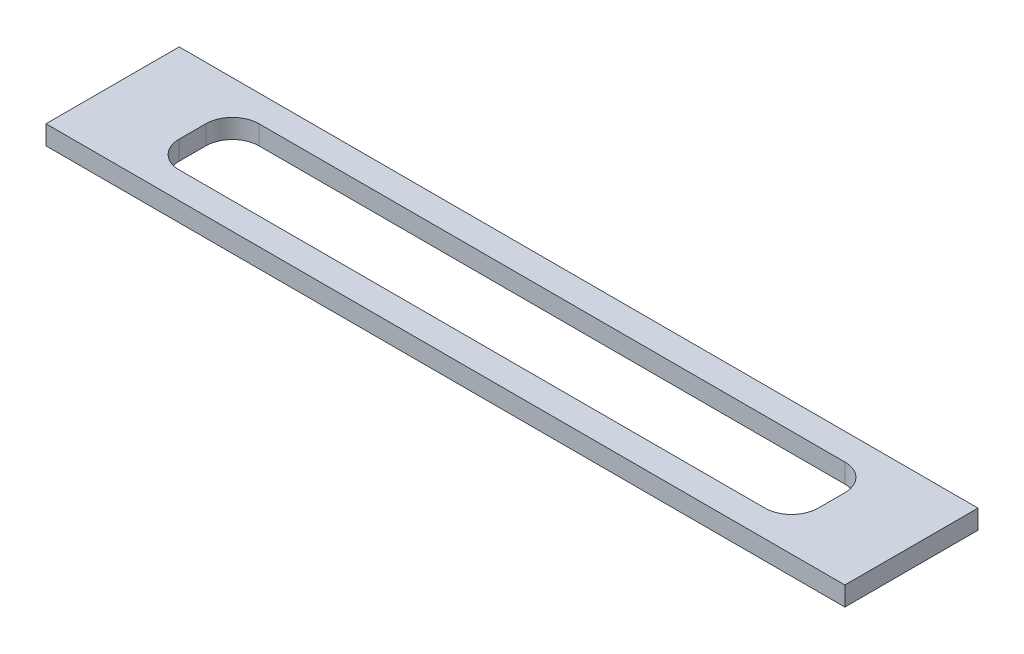
ISO-10303-21;
HEADER;
FILE_DESCRIPTION(('STEP AP214'),'2;1');
FILE_NAME('part.step','',(''),(''),'','','');
FILE_SCHEMA(('AUTOMOTIVE_DESIGN { 1 0 10303 214 1 1 1 1 }'));
ENDSEC;
DATA;
#1=APPLICATION_CONTEXT('core data for automotive mechanical design processes');
#2=APPLICATION_PROTOCOL_DEFINITION('international standard','automotive_design',2000,#1);
#3=PRODUCT_CONTEXT('',#1,'mechanical');
#4=PRODUCT('Part','Part','',(#3));
#5=PRODUCT_RELATED_PRODUCT_CATEGORY('part','',(#4));
#6=PRODUCT_DEFINITION_FORMATION('','',#4);
#7=PRODUCT_DEFINITION_CONTEXT('part definition',#1,'design');
#8=PRODUCT_DEFINITION('design','',#6,#7);
#9=PRODUCT_DEFINITION_SHAPE('','',#8);
#10=(LENGTH_UNIT() NAMED_UNIT(*) SI_UNIT(.MILLI.,.METRE.));
#11=(NAMED_UNIT(*) PLANE_ANGLE_UNIT() SI_UNIT($,.RADIAN.));
#12=(NAMED_UNIT(*) SI_UNIT($,.STERADIAN.) SOLID_ANGLE_UNIT());
#13=UNCERTAINTY_MEASURE_WITH_UNIT(LENGTH_MEASURE(1.E-05),#10,'distance_accuracy_value','');
#14=(GEOMETRIC_REPRESENTATION_CONTEXT(3) GLOBAL_UNCERTAINTY_ASSIGNED_CONTEXT((#13)) GLOBAL_UNIT_ASSIGNED_CONTEXT((#10,
#11,#12)) REPRESENTATION_CONTEXT('',''));
#15=CARTESIAN_POINT('',(0.,0.,0.));
#16=DIRECTION('',(0.,0.,1.));
#17=DIRECTION('',(1.,0.,0.));
#18=AXIS2_PLACEMENT_3D('',#15,#16,#17);
#19=CARTESIAN_POINT('',(-691.829571311172,18.288,43.3638310405165));
#20=DIRECTION('',(1.,0.,0.));
#21=DIRECTION('',(0.,0.,-1.));
#22=AXIS2_PLACEMENT_3D('',#19,#20,#21);
#23=PLANE('',#22);
#24=DIRECTION('',(0.,0.,1.));
#25=VECTOR('',#24,1.);
#26=CARTESIAN_POINT('',(-691.829571311172,0.,43.3638310405165));
#27=LINE('',#26,#25);
#28=CARTESIAN_POINT('',(-691.829571311172,0.,43.3638310405165));
#29=VERTEX_POINT('',#28);
#30=CARTESIAN_POINT('',(-691.829571311172,0.,170.363831040516));
#31=VERTEX_POINT('',#30);
#32=EDGE_CURVE('E150',#29,#31,#27,.T.);
#33=ORIENTED_EDGE('',*,*,#32,.T.);
#34=DIRECTION('',(0.,-1.,0.));
#35=VECTOR('',#34,1.);
#36=CARTESIAN_POINT('',(-691.829571311172,18.288,170.363831040516));
#37=LINE('',#36,#35);
#38=CARTESIAN_POINT('',(-691.829571311172,18.288,170.363831040516));
#39=VERTEX_POINT('',#38);
#40=EDGE_CURVE('E131',#39,#31,#37,.T.);
#41=ORIENTED_EDGE('',*,*,#40,.F.);
#42=DIRECTION('',(0.,0.,1.));
#43=VECTOR('',#42,1.);
#44=CARTESIAN_POINT('',(-691.829571311172,18.288,43.3638310405165));
#45=LINE('',#44,#43);
#46=CARTESIAN_POINT('',(-691.829571311172,18.288,43.3638310405165));
#47=VERTEX_POINT('',#46);
#48=EDGE_CURVE('E138',#47,#39,#45,.T.);
#49=ORIENTED_EDGE('',*,*,#48,.F.);
#50=DIRECTION('',(0.,-1.,0.));
#51=VECTOR('',#50,1.);
#52=CARTESIAN_POINT('',(-691.829571311172,18.288,43.3638310405165));
#53=LINE('',#52,#51);
#54=EDGE_CURVE('E222',#47,#29,#53,.T.);
#55=ORIENTED_EDGE('',*,*,#54,.T.);
#56=EDGE_LOOP('',(#33,#41,#49,#55));
#57=FACE_BOUND('',#56,.T.);
#58=ADVANCED_FACE('F38',(#57),#23,.F.);
#59=CARTESIAN_POINT('',(-691.829571311172,18.288,170.363831040516));
#60=DIRECTION('',(0.,0.,-1.));
#61=DIRECTION('',(-1.,0.,0.));
#62=AXIS2_PLACEMENT_3D('',#59,#60,#61);
#63=PLANE('',#62);
#64=DIRECTION('',(1.,0.,0.));
#65=VECTOR('',#64,1.);
#66=CARTESIAN_POINT('',(-691.829571311172,0.,170.363831040516));
#67=LINE('',#66,#65);
#68=CARTESIAN_POINT('',(70.1704286888285,0.,170.363831040516));
#69=VERTEX_POINT('',#68);
#70=EDGE_CURVE('E224',#31,#69,#67,.T.);
#71=ORIENTED_EDGE('',*,*,#70,.T.);
#72=DIRECTION('',(0.,-1.,0.));
#73=VECTOR('',#72,1.);
#74=CARTESIAN_POINT('',(70.1704286888285,18.288,170.363831040516));
#75=LINE('',#74,#73);
#76=CARTESIAN_POINT('',(70.1704286888285,18.288,170.363831040516));
#77=VERTEX_POINT('',#76);
#78=EDGE_CURVE('E134',#77,#69,#75,.T.);
#79=ORIENTED_EDGE('',*,*,#78,.F.);
#80=DIRECTION('',(1.,0.,0.));
#81=VECTOR('',#80,1.);
#82=CARTESIAN_POINT('',(-691.829571311172,18.288,170.363831040516));
#83=LINE('',#82,#81);
#84=EDGE_CURVE('E127',#39,#77,#83,.T.);
#85=ORIENTED_EDGE('',*,*,#84,.F.);
#86=ORIENTED_EDGE('',*,*,#40,.T.);
#87=EDGE_LOOP('',(#71,#79,#85,#86));
#88=FACE_BOUND('',#87,.T.);
#89=ADVANCED_FACE('F129',(#88),#63,.F.);
#90=CARTESIAN_POINT('',(70.1704286888286,18.288,43.3638310405165));
#91=DIRECTION('',(-1.,0.,0.));
#92=DIRECTION('',(0.,0.,1.));
#93=AXIS2_PLACEMENT_3D('',#90,#91,#92);
#94=PLANE('',#93);
#95=DIRECTION('',(0.,0.,-1.));
#96=VECTOR('',#95,1.);
#97=CARTESIAN_POINT('',(70.1704286888286,0.,43.3638310405165));
#98=LINE('',#97,#96);
#99=CARTESIAN_POINT('',(70.1704286888286,0.,43.3638310405165));
#100=VERTEX_POINT('',#99);
#101=EDGE_CURVE('E226',#69,#100,#98,.T.);
#102=ORIENTED_EDGE('',*,*,#101,.T.);
#103=DIRECTION('',(0.,-1.,0.));
#104=VECTOR('',#103,1.);
#105=CARTESIAN_POINT('',(70.1704286888286,18.288,43.3638310405165));
#106=LINE('',#105,#104);
#107=CARTESIAN_POINT('',(70.1704286888286,18.288,43.3638310405165));
#108=VERTEX_POINT('',#107);
#109=EDGE_CURVE('E155',#108,#100,#106,.T.);
#110=ORIENTED_EDGE('',*,*,#109,.F.);
#111=DIRECTION('',(0.,0.,-1.));
#112=VECTOR('',#111,1.);
#113=CARTESIAN_POINT('',(70.1704286888286,18.288,43.3638310405165));
#114=LINE('',#113,#112);
#115=EDGE_CURVE('E137',#77,#108,#114,.T.);
#116=ORIENTED_EDGE('',*,*,#115,.F.);
#117=ORIENTED_EDGE('',*,*,#78,.T.);
#118=EDGE_LOOP('',(#102,#110,#116,#117));
#119=FACE_BOUND('',#118,.T.);
#120=ADVANCED_FACE('F238',(#119),#94,.F.);
#121=CARTESIAN_POINT('',(-691.829571311172,18.288,43.3638310405165));
#122=DIRECTION('',(0.,0.,1.));
#123=DIRECTION('',(1.,0.,0.));
#124=AXIS2_PLACEMENT_3D('',#121,#122,#123);
#125=PLANE('',#124);
#126=DIRECTION('',(-1.,0.,0.));
#127=VECTOR('',#126,1.);
#128=CARTESIAN_POINT('',(-691.829571311172,0.,43.3638310405165));
#129=LINE('',#128,#127);
#130=EDGE_CURVE('E147',#100,#29,#129,.T.);
#131=ORIENTED_EDGE('',*,*,#130,.T.);
#132=ORIENTED_EDGE('',*,*,#54,.F.);
#133=DIRECTION('',(-1.,0.,0.));
#134=VECTOR('',#133,1.);
#135=CARTESIAN_POINT('',(-691.829571311172,18.288,43.3638310405165));
#136=LINE('',#135,#134);
#137=EDGE_CURVE('E143',#108,#47,#136,.T.);
#138=ORIENTED_EDGE('',*,*,#137,.F.);
#139=ORIENTED_EDGE('',*,*,#109,.T.);
#140=EDGE_LOOP('',(#131,#132,#138,#139));
#141=FACE_BOUND('',#140,.T.);
#142=ADVANCED_FACE('F233',(#141),#125,.F.);
#143=CARTESIAN_POINT('',(0.,18.288,0.));
#144=DIRECTION('',(0.,1.,0.));
#145=DIRECTION('',(0.,0.,1.));
#146=AXIS2_PLACEMENT_3D('',#143,#144,#145);
#147=PLANE('',#146);
#148=DIRECTION('',(0.,0.,-1.));
#149=VECTOR('',#148,1.);
#150=CARTESIAN_POINT('',(-6.0295713111715,18.288,144.963831040516));
#151=LINE('',#150,#149);
#152=CARTESIAN_POINT('',(-6.0295713111715,18.288,119.563831040516));
#153=VERTEX_POINT('',#152);
#154=CARTESIAN_POINT('',(-6.0295713111715,18.288,94.1638310405165));
#155=VERTEX_POINT('',#154);
#156=EDGE_CURVE('E200',#153,#155,#151,.T.);
#157=ORIENTED_EDGE('',*,*,#156,.F.);
#158=CARTESIAN_POINT('',(-31.4295713111715,18.288,119.563831040516));
#159=DIRECTION('',(0.,1.,0.));
#160=DIRECTION('',(0.,0.,1.));
#161=AXIS2_PLACEMENT_3D('',#158,#159,#160);
#162=CIRCLE('',#161,25.4);
#163=CARTESIAN_POINT('',(-31.4295713111717,18.288,144.963831040516));
#164=VERTEX_POINT('',#163);
#165=EDGE_CURVE('E179',#153,#164,#162,.F.);
#166=ORIENTED_EDGE('',*,*,#165,.T.);
#167=DIRECTION('',(1.,0.,0.));
#168=VECTOR('',#167,1.);
#169=CARTESIAN_POINT('',(-615.629571311172,18.288,144.963831040516));
#170=LINE('',#169,#168);
#171=CARTESIAN_POINT('',(-590.229571311172,18.288,144.963831040516));
#172=VERTEX_POINT('',#171);
#173=EDGE_CURVE('E217',#172,#164,#170,.T.);
#174=ORIENTED_EDGE('',*,*,#173,.F.);
#175=CARTESIAN_POINT('',(-590.229571311172,18.288,119.563831040516));
#176=DIRECTION('',(0.,1.,0.));
#177=DIRECTION('',(0.,0.,1.));
#178=AXIS2_PLACEMENT_3D('',#175,#176,#177);
#179=CIRCLE('',#178,25.4);
#180=CARTESIAN_POINT('',(-615.629571311172,18.288,119.563831040516));
#181=VERTEX_POINT('',#180);
#182=EDGE_CURVE('E183',#172,#181,#179,.F.);
#183=ORIENTED_EDGE('',*,*,#182,.T.);
#184=DIRECTION('',(0.,0.,1.));
#185=VECTOR('',#184,1.);
#186=CARTESIAN_POINT('',(-615.629571311172,18.288,144.963831040516));
#187=LINE('',#186,#185);
#188=CARTESIAN_POINT('',(-615.629571311172,18.288,94.1638310405165));
#189=VERTEX_POINT('',#188);
#190=EDGE_CURVE('E192',#189,#181,#187,.T.);
#191=ORIENTED_EDGE('',*,*,#190,.F.);
#192=CARTESIAN_POINT('',(-590.229571311172,18.288,94.1638310405165));
#193=DIRECTION('',(0.,1.,0.));
#194=DIRECTION('',(0.,0.,1.));
#195=AXIS2_PLACEMENT_3D('',#192,#193,#194);
#196=CIRCLE('',#195,25.4);
#197=CARTESIAN_POINT('',(-590.229571311172,18.288,68.7638310405165));
#198=VERTEX_POINT('',#197);
#199=EDGE_CURVE('E46',#189,#198,#196,.F.);
#200=ORIENTED_EDGE('',*,*,#199,.T.);
#201=DIRECTION('',(-1.,0.,0.));
#202=VECTOR('',#201,1.);
#203=CARTESIAN_POINT('',(-615.629571311172,18.288,68.7638310405165));
#204=LINE('',#203,#202);
#205=CARTESIAN_POINT('',(-31.4295713111717,18.288,68.7638310405165));
#206=VERTEX_POINT('',#205);
#207=EDGE_CURVE('E191',#206,#198,#204,.T.);
#208=ORIENTED_EDGE('',*,*,#207,.F.);
#209=CARTESIAN_POINT('',(-31.4295713111715,18.288,94.1638310405165));
#210=DIRECTION('',(0.,1.,0.));
#211=DIRECTION('',(0.,0.,1.));
#212=AXIS2_PLACEMENT_3D('',#209,#210,#211);
#213=CIRCLE('',#212,25.4);
#214=EDGE_CURVE('E175',#206,#155,#213,.F.);
#215=ORIENTED_EDGE('',*,*,#214,.T.);
#216=EDGE_LOOP('',(#157,#166,#174,#183,#191,#200,#208,#215));
#217=FACE_BOUND('',#216,.T.);
#218=ORIENTED_EDGE('',*,*,#48,.T.);
#219=ORIENTED_EDGE('',*,*,#84,.T.);
#220=ORIENTED_EDGE('',*,*,#115,.T.);
#221=ORIENTED_EDGE('',*,*,#137,.T.);
#222=EDGE_LOOP('',(#218,#219,#220,#221));
#223=FACE_BOUND('',#222,.T.);
#224=ADVANCED_FACE('F141',(#217,#223),#147,.T.);
#225=CARTESIAN_POINT('',(0.,0.,0.));
#226=DIRECTION('',(0.,1.,0.));
#227=DIRECTION('',(0.,0.,1.));
#228=AXIS2_PLACEMENT_3D('',#225,#226,#227);
#229=PLANE('',#228);
#230=DIRECTION('',(0.,0.,1.));
#231=VECTOR('',#230,1.);
#232=CARTESIAN_POINT('',(-615.629571311172,0.,144.963831040516));
#233=LINE('',#232,#231);
#234=CARTESIAN_POINT('',(-615.629571311172,0.,94.1638310405165));
#235=VERTEX_POINT('',#234);
#236=CARTESIAN_POINT('',(-615.629571311172,0.,119.563831040516));
#237=VERTEX_POINT('',#236);
#238=EDGE_CURVE('E203',#235,#237,#233,.T.);
#239=ORIENTED_EDGE('',*,*,#238,.T.);
#240=CARTESIAN_POINT('',(-590.229571311172,0.,119.563831040516));
#241=DIRECTION('',(0.,1.,0.));
#242=DIRECTION('',(0.,0.,1.));
#243=AXIS2_PLACEMENT_3D('',#240,#241,#242);
#244=CIRCLE('',#243,25.4);
#245=CARTESIAN_POINT('',(-590.229571311172,0.,144.963831040516));
#246=VERTEX_POINT('',#245);
#247=EDGE_CURVE('E185',#237,#246,#244,.T.);
#248=ORIENTED_EDGE('',*,*,#247,.T.);
#249=DIRECTION('',(1.,0.,0.));
#250=VECTOR('',#249,1.);
#251=CARTESIAN_POINT('',(-615.629571311172,0.,144.963831040516));
#252=LINE('',#251,#250);
#253=CARTESIAN_POINT('',(-31.4295713111717,0.,144.963831040516));
#254=VERTEX_POINT('',#253);
#255=EDGE_CURVE('E205',#246,#254,#252,.T.);
#256=ORIENTED_EDGE('',*,*,#255,.T.);
#257=CARTESIAN_POINT('',(-31.4295713111715,0.,119.563831040516));
#258=DIRECTION('',(0.,1.,0.));
#259=DIRECTION('',(0.,0.,1.));
#260=AXIS2_PLACEMENT_3D('',#257,#258,#259);
#261=CIRCLE('',#260,25.4);
#262=CARTESIAN_POINT('',(-6.0295713111715,0.,119.563831040516));
#263=VERTEX_POINT('',#262);
#264=EDGE_CURVE('E181',#254,#263,#261,.T.);
#265=ORIENTED_EDGE('',*,*,#264,.T.);
#266=DIRECTION('',(0.,0.,-1.));
#267=VECTOR('',#266,1.);
#268=CARTESIAN_POINT('',(-6.0295713111715,0.,144.963831040516));
#269=LINE('',#268,#267);
#270=CARTESIAN_POINT('',(-6.0295713111715,0.,94.1638310405165));
#271=VERTEX_POINT('',#270);
#272=EDGE_CURVE('E210',#263,#271,#269,.T.);
#273=ORIENTED_EDGE('',*,*,#272,.T.);
#274=CARTESIAN_POINT('',(-31.4295713111715,0.,94.1638310405165));
#275=DIRECTION('',(0.,1.,0.));
#276=DIRECTION('',(0.,0.,1.));
#277=AXIS2_PLACEMENT_3D('',#274,#275,#276);
#278=CIRCLE('',#277,25.4);
#279=CARTESIAN_POINT('',(-31.4295713111717,0.,68.7638310405165));
#280=VERTEX_POINT('',#279);
#281=EDGE_CURVE('E177',#271,#280,#278,.T.);
#282=ORIENTED_EDGE('',*,*,#281,.T.);
#283=DIRECTION('',(-1.,0.,0.));
#284=VECTOR('',#283,1.);
#285=CARTESIAN_POINT('',(-615.629571311172,0.,68.7638310405165));
#286=LINE('',#285,#284);
#287=CARTESIAN_POINT('',(-590.229571311172,0.,68.7638310405165));
#288=VERTEX_POINT('',#287);
#289=EDGE_CURVE('E206',#280,#288,#286,.T.);
#290=ORIENTED_EDGE('',*,*,#289,.T.);
#291=CARTESIAN_POINT('',(-590.229571311172,0.,94.1638310405165));
#292=DIRECTION('',(0.,1.,0.));
#293=DIRECTION('',(0.,0.,1.));
#294=AXIS2_PLACEMENT_3D('',#291,#292,#293);
#295=CIRCLE('',#294,25.4);
#296=EDGE_CURVE('E11',#288,#235,#295,.T.);
#297=ORIENTED_EDGE('',*,*,#296,.T.);
#298=EDGE_LOOP('',(#239,#248,#256,#265,#273,#282,#290,#297));
#299=FACE_BOUND('',#298,.T.);
#300=ORIENTED_EDGE('',*,*,#32,.F.);
#301=ORIENTED_EDGE('',*,*,#130,.F.);
#302=ORIENTED_EDGE('',*,*,#101,.F.);
#303=ORIENTED_EDGE('',*,*,#70,.F.);
#304=EDGE_LOOP('',(#300,#301,#302,#303));
#305=FACE_BOUND('',#304,.T.);
#306=ADVANCED_FACE('F237',(#299,#305),#229,.F.);
#307=CARTESIAN_POINT('',(-6.0295713111715,0.,144.963831040516));
#308=DIRECTION('',(1.,0.,0.));
#309=DIRECTION('',(0.,0.,-1.));
#310=AXIS2_PLACEMENT_3D('',#307,#308,#309);
#311=PLANE('',#310);
#312=ORIENTED_EDGE('',*,*,#156,.T.);
#313=DIRECTION('',(0.,1.,0.));
#314=VECTOR('',#313,1.);
#315=CARTESIAN_POINT('',(-6.0295713111715,0.,94.1638310405165));
#316=LINE('',#315,#314);
#317=EDGE_CURVE('E164',#155,#271,#316,.F.);
#318=ORIENTED_EDGE('',*,*,#317,.T.);
#319=ORIENTED_EDGE('',*,*,#272,.F.);
#320=DIRECTION('',(0.,1.,0.));
#321=VECTOR('',#320,1.);
#322=CARTESIAN_POINT('',(-6.0295713111715,18.288,119.563831040516));
#323=LINE('',#322,#321);
#324=EDGE_CURVE('E161',#263,#153,#323,.T.);
#325=ORIENTED_EDGE('',*,*,#324,.T.);
#326=EDGE_LOOP('',(#312,#318,#319,#325));
#327=FACE_BOUND('',#326,.T.);
#328=ADVANCED_FACE('F277',(#327),#311,.F.);
#329=CARTESIAN_POINT('',(-615.629571311172,0.,144.963831040516));
#330=DIRECTION('',(0.,0.,1.));
#331=DIRECTION('',(1.,0.,0.));
#332=AXIS2_PLACEMENT_3D('',#329,#330,#331);
#333=PLANE('',#332);
#334=ORIENTED_EDGE('',*,*,#173,.T.);
#335=DIRECTION('',(0.,1.,0.));
#336=VECTOR('',#335,1.);
#337=CARTESIAN_POINT('',(-31.4295713111715,0.,144.963831040516));
#338=LINE('',#337,#336);
#339=EDGE_CURVE('E169',#164,#254,#338,.F.);
#340=ORIENTED_EDGE('',*,*,#339,.T.);
#341=ORIENTED_EDGE('',*,*,#255,.F.);
#342=DIRECTION('',(0.,1.,0.));
#343=VECTOR('',#342,1.);
#344=CARTESIAN_POINT('',(-590.229571311172,18.288,144.963831040516));
#345=LINE('',#344,#343);
#346=EDGE_CURVE('E166',#246,#172,#345,.T.);
#347=ORIENTED_EDGE('',*,*,#346,.T.);
#348=EDGE_LOOP('',(#334,#340,#341,#347));
#349=FACE_BOUND('',#348,.T.);
#350=ADVANCED_FACE('F269',(#349),#333,.F.);
#351=CARTESIAN_POINT('',(-615.629571311172,0.,144.963831040516));
#352=DIRECTION('',(-1.,0.,0.));
#353=DIRECTION('',(0.,0.,1.));
#354=AXIS2_PLACEMENT_3D('',#351,#352,#353);
#355=PLANE('',#354);
#356=ORIENTED_EDGE('',*,*,#190,.T.);
#357=DIRECTION('',(0.,1.,0.));
#358=VECTOR('',#357,1.);
#359=CARTESIAN_POINT('',(-615.629571311172,0.,119.563831040516));
#360=LINE('',#359,#358);
#361=EDGE_CURVE('E53',#181,#237,#360,.F.);
#362=ORIENTED_EDGE('',*,*,#361,.T.);
#363=ORIENTED_EDGE('',*,*,#238,.F.);
#364=DIRECTION('',(0.,1.,0.));
#365=VECTOR('',#364,1.);
#366=CARTESIAN_POINT('',(-615.629571311172,18.288,94.1638310405165));
#367=LINE('',#366,#365);
#368=EDGE_CURVE('E171',#235,#189,#367,.T.);
#369=ORIENTED_EDGE('',*,*,#368,.T.);
#370=EDGE_LOOP('',(#356,#362,#363,#369));
#371=FACE_BOUND('',#370,.T.);
#372=ADVANCED_FACE('F202',(#371),#355,.F.);
#373=CARTESIAN_POINT('',(-615.629571311172,0.,68.7638310405165));
#374=DIRECTION('',(0.,0.,-1.));
#375=DIRECTION('',(-1.,0.,0.));
#376=AXIS2_PLACEMENT_3D('',#373,#374,#375);
#377=PLANE('',#376);
#378=ORIENTED_EDGE('',*,*,#289,.F.);
#379=DIRECTION('',(0.,1.,0.));
#380=VECTOR('',#379,1.);
#381=CARTESIAN_POINT('',(-31.4295713111715,18.288,68.7638310405165));
#382=LINE('',#381,#380);
#383=EDGE_CURVE('E153',#280,#206,#382,.T.);
#384=ORIENTED_EDGE('',*,*,#383,.T.);
#385=ORIENTED_EDGE('',*,*,#207,.T.);
#386=DIRECTION('',(0.,1.,0.));
#387=VECTOR('',#386,1.);
#388=CARTESIAN_POINT('',(-590.229571311172,0.,68.7638310405165));
#389=LINE('',#388,#387);
#390=EDGE_CURVE('E151',#198,#288,#389,.F.);
#391=ORIENTED_EDGE('',*,*,#390,.T.);
#392=EDGE_LOOP('',(#378,#384,#385,#391));
#393=FACE_BOUND('',#392,.T.);
#394=ADVANCED_FACE('F198',(#393),#377,.F.);
#395=CARTESIAN_POINT('',(-31.4295713111715,0.,94.1638310405165));
#396=DIRECTION('',(0.,-1.,0.));
#397=DIRECTION('',(0.,0.,-1.));
#398=AXIS2_PLACEMENT_3D('',#395,#396,#397);
#399=CYLINDRICAL_SURFACE('',#398,25.4);
#400=ORIENTED_EDGE('',*,*,#281,.F.);
#401=ORIENTED_EDGE('',*,*,#317,.F.);
#402=ORIENTED_EDGE('',*,*,#214,.F.);
#403=ORIENTED_EDGE('',*,*,#383,.F.);
#404=EDGE_LOOP('',(#400,#401,#402,#403));
#405=FACE_BOUND('',#404,.T.);
#406=ADVANCED_FACE('F252',(#405),#399,.F.);
#407=CARTESIAN_POINT('',(-31.4295713111715,0.,119.563831040516));
#408=DIRECTION('',(0.,-1.,0.));
#409=DIRECTION('',(0.,0.,-1.));
#410=AXIS2_PLACEMENT_3D('',#407,#408,#409);
#411=CYLINDRICAL_SURFACE('',#410,25.4);
#412=ORIENTED_EDGE('',*,*,#264,.F.);
#413=ORIENTED_EDGE('',*,*,#339,.F.);
#414=ORIENTED_EDGE('',*,*,#165,.F.);
#415=ORIENTED_EDGE('',*,*,#324,.F.);
#416=EDGE_LOOP('',(#412,#413,#414,#415));
#417=FACE_BOUND('',#416,.T.);
#418=ADVANCED_FACE('F255',(#417),#411,.F.);
#419=CARTESIAN_POINT('',(-590.229571311172,0.,119.563831040516));
#420=DIRECTION('',(0.,-1.,0.));
#421=DIRECTION('',(0.,0.,-1.));
#422=AXIS2_PLACEMENT_3D('',#419,#420,#421);
#423=CYLINDRICAL_SURFACE('',#422,25.4);
#424=ORIENTED_EDGE('',*,*,#247,.F.);
#425=ORIENTED_EDGE('',*,*,#361,.F.);
#426=ORIENTED_EDGE('',*,*,#182,.F.);
#427=ORIENTED_EDGE('',*,*,#346,.F.);
#428=EDGE_LOOP('',(#424,#425,#426,#427));
#429=FACE_BOUND('',#428,.T.);
#430=ADVANCED_FACE('F258',(#429),#423,.F.);
#431=CARTESIAN_POINT('',(-590.229571311172,0.,94.1638310405165));
#432=DIRECTION('',(0.,-1.,0.));
#433=DIRECTION('',(0.,0.,-1.));
#434=AXIS2_PLACEMENT_3D('',#431,#432,#433);
#435=CYLINDRICAL_SURFACE('',#434,25.4);
#436=ORIENTED_EDGE('',*,*,#296,.F.);
#437=ORIENTED_EDGE('',*,*,#390,.F.);
#438=ORIENTED_EDGE('',*,*,#199,.F.);
#439=ORIENTED_EDGE('',*,*,#368,.F.);
#440=EDGE_LOOP('',(#436,#437,#438,#439));
#441=FACE_BOUND('',#440,.T.);
#442=ADVANCED_FACE('F40',(#441),#435,.F.);
#443=CLOSED_SHELL('',(#58,#89,#120,#142,#224,#306,#328,#350,#372,#394,#406,#418,#430,#442));
#444=MANIFOLD_SOLID_BREP('B2',#443);
#445=ADVANCED_BREP_SHAPE_REPRESENTATION('',(#18,#444),#14);
#446=SHAPE_DEFINITION_REPRESENTATION(#9,#445);
ENDSEC;
END-ISO-10303-21;
